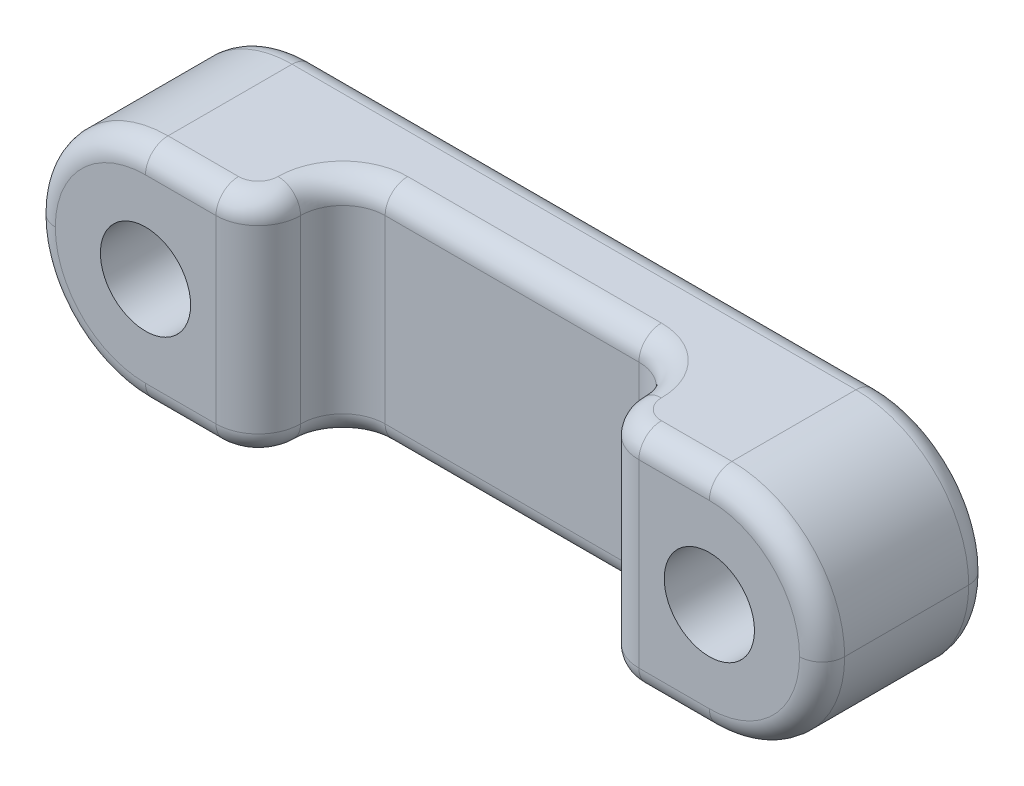
ISO-10303-21;
HEADER;
FILE_DESCRIPTION(('STEP AP214'),'2;1');
FILE_NAME('part.step','',(''),(''),'','','');
FILE_SCHEMA(('AUTOMOTIVE_DESIGN { 1 0 10303 214 1 1 1 1 }'));
ENDSEC;
DATA;
#1=APPLICATION_CONTEXT('core data for automotive mechanical design processes');
#2=APPLICATION_PROTOCOL_DEFINITION('international standard','automotive_design',2000,#1);
#3=PRODUCT_CONTEXT('',#1,'mechanical');
#4=PRODUCT('Part','Part','',(#3));
#5=PRODUCT_RELATED_PRODUCT_CATEGORY('part','',(#4));
#6=PRODUCT_DEFINITION_FORMATION('','',#4);
#7=PRODUCT_DEFINITION_CONTEXT('part definition',#1,'design');
#8=PRODUCT_DEFINITION('design','',#6,#7);
#9=PRODUCT_DEFINITION_SHAPE('','',#8);
#10=(LENGTH_UNIT() NAMED_UNIT(*) SI_UNIT(.MILLI.,.METRE.));
#11=(NAMED_UNIT(*) PLANE_ANGLE_UNIT() SI_UNIT($,.RADIAN.));
#12=(NAMED_UNIT(*) SI_UNIT($,.STERADIAN.) SOLID_ANGLE_UNIT());
#13=UNCERTAINTY_MEASURE_WITH_UNIT(LENGTH_MEASURE(1.E-05),#10,'distance_accuracy_value','');
#14=(GEOMETRIC_REPRESENTATION_CONTEXT(3) GLOBAL_UNCERTAINTY_ASSIGNED_CONTEXT((#13)) GLOBAL_UNIT_ASSIGNED_CONTEXT((#10,
#11,#12)) REPRESENTATION_CONTEXT('',''));
#15=CARTESIAN_POINT('',(0.,0.,0.));
#16=DIRECTION('',(0.,0.,1.));
#17=DIRECTION('',(1.,0.,0.));
#18=AXIS2_PLACEMENT_3D('',#15,#16,#17);
#19=CARTESIAN_POINT('',(0.,0.,3.));
#20=DIRECTION('',(0.,0.,-1.));
#21=DIRECTION('',(-1.,0.,0.));
#22=AXIS2_PLACEMENT_3D('',#19,#20,#21);
#23=PLANE('',#22);
#24=DIRECTION('',(0.,-1.,0.));
#25=VECTOR('',#24,1.);
#26=CARTESIAN_POINT('',(18.5,8.,3.));
#27=LINE('',#26,#25);
#28=CARTESIAN_POINT('',(18.5,0.8,3.));
#29=VERTEX_POINT('',#28);
#30=CARTESIAN_POINT('',(18.5,7.2,3.));
#31=VERTEX_POINT('',#30);
#32=EDGE_CURVE('E226',#29,#31,#27,.F.);
#33=ORIENTED_EDGE('',*,*,#32,.T.);
#34=DIRECTION('',(-1.,0.,0.));
#35=VECTOR('',#34,1.);
#36=CARTESIAN_POINT('',(0.,7.2,3.));
#37=LINE('',#36,#35);
#38=CARTESIAN_POINT('',(9.5,7.2,3.));
#39=VERTEX_POINT('',#38);
#40=EDGE_CURVE('E286',#31,#39,#37,.T.);
#41=ORIENTED_EDGE('',*,*,#40,.T.);
#42=DIRECTION('',(0.,1.,0.));
#43=VECTOR('',#42,1.);
#44=CARTESIAN_POINT('',(9.5,0.,3.));
#45=LINE('',#44,#43);
#46=CARTESIAN_POINT('',(9.5,0.8,3.));
#47=VERTEX_POINT('',#46);
#48=EDGE_CURVE('E229',#39,#47,#45,.F.);
#49=ORIENTED_EDGE('',*,*,#48,.T.);
#50=DIRECTION('',(1.,0.,0.));
#51=VECTOR('',#50,1.);
#52=CARTESIAN_POINT('',(0.,0.8,3.));
#53=LINE('',#52,#51);
#54=EDGE_CURVE('E284',#47,#29,#53,.T.);
#55=ORIENTED_EDGE('',*,*,#54,.T.);
#56=EDGE_LOOP('',(#33,#41,#49,#55));
#57=FACE_BOUND('',#56,.T.);
#58=ADVANCED_FACE('F41',(#57),#23,.F.);
#59=CARTESIAN_POINT('',(0.,0.,0.));
#60=DIRECTION('',(0.,0.,-1.));
#61=DIRECTION('',(-1.,0.,0.));
#62=AXIS2_PLACEMENT_3D('',#59,#60,#61);
#63=PLANE('',#62);
#64=DIRECTION('',(1.,0.,0.));
#65=VECTOR('',#64,1.);
#66=CARTESIAN_POINT('',(4.,0.8,0.));
#67=LINE('',#66,#65);
#68=CARTESIAN_POINT('',(24.,0.8,0.));
#69=VERTEX_POINT('',#68);
#70=CARTESIAN_POINT('',(4.,0.8,0.));
#71=VERTEX_POINT('',#70);
#72=EDGE_CURVE('E205',#69,#71,#67,.F.);
#73=ORIENTED_EDGE('',*,*,#72,.T.);
#74=CARTESIAN_POINT('',(4.,4.,0.));
#75=DIRECTION('',(0.,0.,-1.));
#76=DIRECTION('',(-1.,0.,0.));
#77=AXIS2_PLACEMENT_3D('',#74,#75,#76);
#78=CIRCLE('',#77,3.2);
#79=CARTESIAN_POINT('',(0.8,4.,0.));
#80=VERTEX_POINT('',#79);
#81=EDGE_CURVE('E240',#71,#80,#78,.T.);
#82=ORIENTED_EDGE('',*,*,#81,.T.);
#83=CARTESIAN_POINT('',(4.,4.,0.));
#84=DIRECTION('',(0.,0.,-1.));
#85=DIRECTION('',(-1.,0.,0.));
#86=AXIS2_PLACEMENT_3D('',#83,#84,#85);
#87=CIRCLE('',#86,3.2);
#88=CARTESIAN_POINT('',(4.,7.2,0.));
#89=VERTEX_POINT('',#88);
#90=EDGE_CURVE('E238',#80,#89,#87,.T.);
#91=ORIENTED_EDGE('',*,*,#90,.T.);
#92=DIRECTION('',(-1.,0.,0.));
#93=VECTOR('',#92,1.);
#94=CARTESIAN_POINT('',(24.,7.2,0.));
#95=LINE('',#94,#93);
#96=CARTESIAN_POINT('',(24.,7.2,0.));
#97=VERTEX_POINT('',#96);
#98=EDGE_CURVE('E236',#89,#97,#95,.F.);
#99=ORIENTED_EDGE('',*,*,#98,.T.);
#100=CARTESIAN_POINT('',(24.,4.,0.));
#101=DIRECTION('',(0.,0.,-1.));
#102=DIRECTION('',(-1.,0.,0.));
#103=AXIS2_PLACEMENT_3D('',#100,#101,#102);
#104=CIRCLE('',#103,3.2);
#105=CARTESIAN_POINT('',(27.2,4.,0.));
#106=VERTEX_POINT('',#105);
#107=EDGE_CURVE('E208',#97,#106,#104,.T.);
#108=ORIENTED_EDGE('',*,*,#107,.T.);
#109=CARTESIAN_POINT('',(24.,4.,0.));
#110=DIRECTION('',(0.,0.,-1.));
#111=DIRECTION('',(-1.,0.,0.));
#112=AXIS2_PLACEMENT_3D('',#109,#110,#111);
#113=CIRCLE('',#112,3.2);
#114=EDGE_CURVE('E199',#106,#69,#113,.T.);
#115=ORIENTED_EDGE('',*,*,#114,.T.);
#116=EDGE_LOOP('',(#73,#82,#91,#99,#108,#115));
#117=FACE_BOUND('',#116,.T.);
#118=CARTESIAN_POINT('',(24.,4.,0.));
#119=DIRECTION('',(0.,0.,1.));
#120=DIRECTION('',(1.,0.,0.));
#121=AXIS2_PLACEMENT_3D('',#118,#119,#120);
#122=CIRCLE('',#121,1.6);
#123=CARTESIAN_POINT('',(25.6,4.,0.));
#124=VERTEX_POINT('',#123);
#125=EDGE_CURVE('E441',#124,#124,#122,.T.);
#126=ORIENTED_EDGE('',*,*,#125,.T.);
#127=EDGE_LOOP('',(#126));
#128=FACE_BOUND('',#127,.T.);
#129=CARTESIAN_POINT('',(4.,4.,0.));
#130=DIRECTION('',(0.,0.,1.));
#131=DIRECTION('',(1.,0.,0.));
#132=AXIS2_PLACEMENT_3D('',#129,#130,#131);
#133=CIRCLE('',#132,1.6);
#134=CARTESIAN_POINT('',(5.6,4.,0.));
#135=VERTEX_POINT('',#134);
#136=EDGE_CURVE('E444',#135,#135,#133,.T.);
#137=ORIENTED_EDGE('',*,*,#136,.T.);
#138=EDGE_LOOP('',(#137));
#139=FACE_BOUND('',#138,.T.);
#140=ADVANCED_FACE('F201',(#117,#128,#139),#63,.T.);
#141=CARTESIAN_POINT('',(0.,0.,3.));
#142=DIRECTION('',(0.,1.,0.));
#143=DIRECTION('',(0.,0.,1.));
#144=AXIS2_PLACEMENT_3D('',#141,#142,#143);
#145=PLANE('',#144);
#146=DIRECTION('',(0.,0.,-1.));
#147=VECTOR('',#146,1.);
#148=CARTESIAN_POINT('',(24.,0.,3.));
#149=LINE('',#148,#147);
#150=CARTESIAN_POINT('',(24.,0.,0.8));
#151=VERTEX_POINT('',#150);
#152=CARTESIAN_POINT('',(24.,0.,5.2));
#153=VERTEX_POINT('',#152);
#154=EDGE_CURVE('E412',#151,#153,#149,.F.);
#155=ORIENTED_EDGE('',*,*,#154,.T.);
#156=DIRECTION('',(1.,0.,0.));
#157=VECTOR('',#156,1.);
#158=CARTESIAN_POINT('',(21.5,0.,5.2));
#159=LINE('',#158,#157);
#160=CARTESIAN_POINT('',(21.5,0.,5.2));
#161=VERTEX_POINT('',#160);
#162=EDGE_CURVE('E318',#153,#161,#159,.F.);
#163=ORIENTED_EDGE('',*,*,#162,.T.);
#164=CARTESIAN_POINT('',(21.5,0.,4.5));
#165=DIRECTION('',(0.,1.,0.));
#166=DIRECTION('',(0.,0.,1.));
#167=AXIS2_PLACEMENT_3D('',#164,#165,#166);
#168=CIRCLE('',#167,0.7);
#169=CARTESIAN_POINT('',(20.8,0.,4.5));
#170=VERTEX_POINT('',#169);
#171=EDGE_CURVE('E316',#161,#170,#168,.F.);
#172=ORIENTED_EDGE('',*,*,#171,.T.);
#173=CARTESIAN_POINT('',(18.5,0.,4.5));
#174=DIRECTION('',(0.,1.,0.));
#175=DIRECTION('',(0.,0.,1.));
#176=AXIS2_PLACEMENT_3D('',#173,#174,#175);
#177=CIRCLE('',#176,2.3);
#178=CARTESIAN_POINT('',(18.5,0.,2.2));
#179=VERTEX_POINT('',#178);
#180=EDGE_CURVE('E314',#170,#179,#177,.T.);
#181=ORIENTED_EDGE('',*,*,#180,.T.);
#182=DIRECTION('',(1.,0.,0.));
#183=VECTOR('',#182,1.);
#184=CARTESIAN_POINT('',(0.,0.,2.2));
#185=LINE('',#184,#183);
#186=CARTESIAN_POINT('',(9.5,0.,2.2));
#187=VERTEX_POINT('',#186);
#188=EDGE_CURVE('E312',#179,#187,#185,.F.);
#189=ORIENTED_EDGE('',*,*,#188,.T.);
#190=CARTESIAN_POINT('',(9.5,0.,4.5));
#191=DIRECTION('',(0.,1.,0.));
#192=DIRECTION('',(0.,0.,1.));
#193=AXIS2_PLACEMENT_3D('',#190,#191,#192);
#194=CIRCLE('',#193,2.3);
#195=CARTESIAN_POINT('',(7.2,0.,4.5));
#196=VERTEX_POINT('',#195);
#197=EDGE_CURVE('E310',#187,#196,#194,.T.);
#198=ORIENTED_EDGE('',*,*,#197,.T.);
#199=CARTESIAN_POINT('',(6.5,0.,4.5));
#200=DIRECTION('',(0.,1.,0.));
#201=DIRECTION('',(0.,0.,1.));
#202=AXIS2_PLACEMENT_3D('',#199,#200,#201);
#203=CIRCLE('',#202,0.7);
#204=CARTESIAN_POINT('',(6.5,0.,5.2));
#205=VERTEX_POINT('',#204);
#206=EDGE_CURVE('E308',#196,#205,#203,.F.);
#207=ORIENTED_EDGE('',*,*,#206,.T.);
#208=DIRECTION('',(1.,0.,0.));
#209=VECTOR('',#208,1.);
#210=CARTESIAN_POINT('',(4.,0.,5.2));
#211=LINE('',#210,#209);
#212=CARTESIAN_POINT('',(4.,0.,5.2));
#213=VERTEX_POINT('',#212);
#214=EDGE_CURVE('E306',#205,#213,#211,.F.);
#215=ORIENTED_EDGE('',*,*,#214,.T.);
#216=DIRECTION('',(0.,0.,-1.));
#217=VECTOR('',#216,1.);
#218=CARTESIAN_POINT('',(4.,0.,3.));
#219=LINE('',#218,#217);
#220=CARTESIAN_POINT('',(4.,0.,0.8));
#221=VERTEX_POINT('',#220);
#222=EDGE_CURVE('E432',#213,#221,#219,.T.);
#223=ORIENTED_EDGE('',*,*,#222,.T.);
#224=DIRECTION('',(1.,0.,0.));
#225=VECTOR('',#224,1.);
#226=CARTESIAN_POINT('',(24.,0.,0.8));
#227=LINE('',#226,#225);
#228=EDGE_CURVE('E304',#221,#151,#227,.T.);
#229=ORIENTED_EDGE('',*,*,#228,.T.);
#230=EDGE_LOOP('',(#155,#163,#172,#181,#189,#198,#207,#215,#223,#229));
#231=FACE_BOUND('',#230,.T.);
#232=ADVANCED_FACE('F474',(#231),#145,.F.);
#233=CARTESIAN_POINT('',(0.,8.,3.));
#234=DIRECTION('',(0.,-1.,0.));
#235=DIRECTION('',(0.,0.,-1.));
#236=AXIS2_PLACEMENT_3D('',#233,#234,#235);
#237=PLANE('',#236);
#238=DIRECTION('',(0.,0.,-1.));
#239=VECTOR('',#238,1.);
#240=CARTESIAN_POINT('',(24.,8.,3.));
#241=LINE('',#240,#239);
#242=CARTESIAN_POINT('',(24.,8.,5.2));
#243=VERTEX_POINT('',#242);
#244=CARTESIAN_POINT('',(24.,8.,0.8));
#245=VERTEX_POINT('',#244);
#246=EDGE_CURVE('E435',#243,#245,#241,.T.);
#247=ORIENTED_EDGE('',*,*,#246,.T.);
#248=DIRECTION('',(-1.,0.,0.));
#249=VECTOR('',#248,1.);
#250=CARTESIAN_POINT('',(4.,8.,0.8));
#251=LINE('',#250,#249);
#252=CARTESIAN_POINT('',(4.,8.,0.8));
#253=VERTEX_POINT('',#252);
#254=EDGE_CURVE('E266',#245,#253,#251,.T.);
#255=ORIENTED_EDGE('',*,*,#254,.T.);
#256=DIRECTION('',(0.,0.,-1.));
#257=VECTOR('',#256,1.);
#258=CARTESIAN_POINT('',(4.,8.,3.));
#259=LINE('',#258,#257);
#260=CARTESIAN_POINT('',(4.,8.,5.2));
#261=VERTEX_POINT('',#260);
#262=EDGE_CURVE('E438',#253,#261,#259,.F.);
#263=ORIENTED_EDGE('',*,*,#262,.T.);
#264=DIRECTION('',(-1.,0.,0.));
#265=VECTOR('',#264,1.);
#266=CARTESIAN_POINT('',(6.5,8.,5.2));
#267=LINE('',#266,#265);
#268=CARTESIAN_POINT('',(6.5,8.,5.2));
#269=VERTEX_POINT('',#268);
#270=EDGE_CURVE('E251',#261,#269,#267,.F.);
#271=ORIENTED_EDGE('',*,*,#270,.T.);
#272=CARTESIAN_POINT('',(6.5,8.,4.5));
#273=DIRECTION('',(0.,-1.,0.));
#274=DIRECTION('',(0.,0.,-1.));
#275=AXIS2_PLACEMENT_3D('',#272,#273,#274);
#276=CIRCLE('',#275,0.7);
#277=CARTESIAN_POINT('',(7.2,8.,4.5));
#278=VERTEX_POINT('',#277);
#279=EDGE_CURVE('E253',#269,#278,#276,.F.);
#280=ORIENTED_EDGE('',*,*,#279,.T.);
#281=CARTESIAN_POINT('',(9.5,8.,4.5));
#282=DIRECTION('',(0.,-1.,0.));
#283=DIRECTION('',(0.,0.,-1.));
#284=AXIS2_PLACEMENT_3D('',#281,#282,#283);
#285=CIRCLE('',#284,2.3);
#286=CARTESIAN_POINT('',(9.5,8.,2.2));
#287=VERTEX_POINT('',#286);
#288=EDGE_CURVE('E256',#278,#287,#285,.T.);
#289=ORIENTED_EDGE('',*,*,#288,.T.);
#290=DIRECTION('',(-1.,0.,0.));
#291=VECTOR('',#290,1.);
#292=CARTESIAN_POINT('',(0.,8.,2.2));
#293=LINE('',#292,#291);
#294=CARTESIAN_POINT('',(18.5,8.,2.2));
#295=VERTEX_POINT('',#294);
#296=EDGE_CURVE('E258',#287,#295,#293,.F.);
#297=ORIENTED_EDGE('',*,*,#296,.T.);
#298=CARTESIAN_POINT('',(18.5,8.,4.5));
#299=DIRECTION('',(0.,-1.,0.));
#300=DIRECTION('',(0.,0.,-1.));
#301=AXIS2_PLACEMENT_3D('',#298,#299,#300);
#302=CIRCLE('',#301,2.3);
#303=CARTESIAN_POINT('',(20.8,8.,4.5));
#304=VERTEX_POINT('',#303);
#305=EDGE_CURVE('E260',#295,#304,#302,.T.);
#306=ORIENTED_EDGE('',*,*,#305,.T.);
#307=CARTESIAN_POINT('',(21.5,8.,4.5));
#308=DIRECTION('',(0.,-1.,0.));
#309=DIRECTION('',(0.,0.,-1.));
#310=AXIS2_PLACEMENT_3D('',#307,#308,#309);
#311=CIRCLE('',#310,0.7);
#312=CARTESIAN_POINT('',(21.5,8.,5.2));
#313=VERTEX_POINT('',#312);
#314=EDGE_CURVE('E262',#304,#313,#311,.F.);
#315=ORIENTED_EDGE('',*,*,#314,.T.);
#316=DIRECTION('',(-1.,0.,0.));
#317=VECTOR('',#316,1.);
#318=CARTESIAN_POINT('',(24.,8.,5.2));
#319=LINE('',#318,#317);
#320=EDGE_CURVE('E264',#313,#243,#319,.F.);
#321=ORIENTED_EDGE('',*,*,#320,.T.);
#322=EDGE_LOOP('',(#247,#255,#263,#271,#280,#289,#297,#306,#315,#321));
#323=FACE_BOUND('',#322,.T.);
#324=ADVANCED_FACE('F479',(#323),#237,.F.);
#325=CARTESIAN_POINT('',(24.,4.,3.));
#326=DIRECTION('',(0.,0.,-1.));
#327=DIRECTION('',(-1.,0.,0.));
#328=AXIS2_PLACEMENT_3D('',#325,#326,#327);
#329=CYLINDRICAL_SURFACE('',#328,1.6);
#330=ORIENTED_EDGE('',*,*,#125,.F.);
#331=EDGE_LOOP('',(#330));
#332=FACE_BOUND('',#331,.T.);
#333=CARTESIAN_POINT('',(24.,4.,6.));
#334=DIRECTION('',(0.,0.,1.));
#335=DIRECTION('',(1.,0.,0.));
#336=AXIS2_PLACEMENT_3D('',#333,#334,#335);
#337=CIRCLE('',#336,1.6);
#338=CARTESIAN_POINT('',(25.6,4.,6.));
#339=VERTEX_POINT('',#338);
#340=EDGE_CURVE('E427',#339,#339,#337,.T.);
#341=ORIENTED_EDGE('',*,*,#340,.T.);
#342=EDGE_LOOP('',(#341));
#343=FACE_BOUND('',#342,.T.);
#344=ADVANCED_FACE('F453',(#332,#343),#329,.F.);
#345=CARTESIAN_POINT('',(4.,4.,3.));
#346=DIRECTION('',(0.,0.,-1.));
#347=DIRECTION('',(-1.,0.,0.));
#348=AXIS2_PLACEMENT_3D('',#345,#346,#347);
#349=CYLINDRICAL_SURFACE('',#348,1.6);
#350=ORIENTED_EDGE('',*,*,#136,.F.);
#351=EDGE_LOOP('',(#350));
#352=FACE_BOUND('',#351,.T.);
#353=CARTESIAN_POINT('',(4.,4.,6.));
#354=DIRECTION('',(0.,0.,1.));
#355=DIRECTION('',(1.,0.,0.));
#356=AXIS2_PLACEMENT_3D('',#353,#354,#355);
#357=CIRCLE('',#356,1.6);
#358=CARTESIAN_POINT('',(5.6,4.,6.));
#359=VERTEX_POINT('',#358);
#360=EDGE_CURVE('E447',#359,#359,#357,.T.);
#361=ORIENTED_EDGE('',*,*,#360,.T.);
#362=EDGE_LOOP('',(#361));
#363=FACE_BOUND('',#362,.T.);
#364=ADVANCED_FACE('F465',(#352,#363),#349,.F.);
#365=CARTESIAN_POINT('',(0.,0.,6.));
#366=DIRECTION('',(0.,0.,1.));
#367=DIRECTION('',(1.,0.,0.));
#368=AXIS2_PLACEMENT_3D('',#365,#366,#367);
#369=PLANE('',#368);
#370=CARTESIAN_POINT('',(4.,4.,6.));
#371=DIRECTION('',(0.,0.,1.));
#372=DIRECTION('',(1.,0.,0.));
#373=AXIS2_PLACEMENT_3D('',#370,#371,#372);
#374=CIRCLE('',#373,3.2);
#375=CARTESIAN_POINT('',(0.8,4.,6.));
#376=VERTEX_POINT('',#375);
#377=CARTESIAN_POINT('',(4.,0.8,6.));
#378=VERTEX_POINT('',#377);
#379=EDGE_CURVE('E50',#376,#378,#374,.T.);
#380=ORIENTED_EDGE('',*,*,#379,.T.);
#381=DIRECTION('',(1.,0.,0.));
#382=VECTOR('',#381,1.);
#383=CARTESIAN_POINT('',(6.5,0.8,6.));
#384=LINE('',#383,#382);
#385=CARTESIAN_POINT('',(6.5,0.8,6.));
#386=VERTEX_POINT('',#385);
#387=EDGE_CURVE('E11',#378,#386,#384,.T.);
#388=ORIENTED_EDGE('',*,*,#387,.T.);
#389=DIRECTION('',(0.,1.,0.));
#390=VECTOR('',#389,1.);
#391=CARTESIAN_POINT('',(6.5,8.,6.));
#392=LINE('',#391,#390);
#393=CARTESIAN_POINT('',(6.5,7.2,6.));
#394=VERTEX_POINT('',#393);
#395=EDGE_CURVE('E407',#386,#394,#392,.T.);
#396=ORIENTED_EDGE('',*,*,#395,.T.);
#397=DIRECTION('',(-1.,0.,0.));
#398=VECTOR('',#397,1.);
#399=CARTESIAN_POINT('',(4.,7.2,6.));
#400=LINE('',#399,#398);
#401=CARTESIAN_POINT('',(4.,7.2,6.));
#402=VERTEX_POINT('',#401);
#403=EDGE_CURVE('E320',#394,#402,#400,.T.);
#404=ORIENTED_EDGE('',*,*,#403,.T.);
#405=CARTESIAN_POINT('',(4.,4.,6.));
#406=DIRECTION('',(0.,0.,1.));
#407=DIRECTION('',(1.,0.,0.));
#408=AXIS2_PLACEMENT_3D('',#405,#406,#407);
#409=CIRCLE('',#408,3.2);
#410=EDGE_CURVE('E61',#402,#376,#409,.T.);
#411=ORIENTED_EDGE('',*,*,#410,.T.);
#412=EDGE_LOOP('',(#380,#388,#396,#404,#411));
#413=FACE_BOUND('',#412,.T.);
#414=ORIENTED_EDGE('',*,*,#360,.F.);
#415=EDGE_LOOP('',(#414));
#416=FACE_BOUND('',#415,.T.);
#417=ADVANCED_FACE('F456',(#413,#416),#369,.T.);
#418=CARTESIAN_POINT('',(0.,0.,6.));
#419=DIRECTION('',(0.,0.,1.));
#420=DIRECTION('',(1.,0.,0.));
#421=AXIS2_PLACEMENT_3D('',#418,#419,#420);
#422=PLANE('',#421);
#423=CARTESIAN_POINT('',(24.,4.,6.));
#424=DIRECTION('',(0.,0.,1.));
#425=DIRECTION('',(1.,0.,0.));
#426=AXIS2_PLACEMENT_3D('',#423,#424,#425);
#427=CIRCLE('',#426,3.2);
#428=CARTESIAN_POINT('',(27.2,4.,6.));
#429=VERTEX_POINT('',#428);
#430=CARTESIAN_POINT('',(24.,7.2,6.));
#431=VERTEX_POINT('',#430);
#432=EDGE_CURVE('E300',#429,#431,#427,.T.);
#433=ORIENTED_EDGE('',*,*,#432,.T.);
#434=DIRECTION('',(-1.,0.,0.));
#435=VECTOR('',#434,1.);
#436=CARTESIAN_POINT('',(21.5,7.2,6.));
#437=LINE('',#436,#435);
#438=CARTESIAN_POINT('',(21.5,7.2,6.));
#439=VERTEX_POINT('',#438);
#440=EDGE_CURVE('E302',#431,#439,#437,.T.);
#441=ORIENTED_EDGE('',*,*,#440,.T.);
#442=DIRECTION('',(0.,-1.,0.));
#443=VECTOR('',#442,1.);
#444=CARTESIAN_POINT('',(21.5,0.,6.));
#445=LINE('',#444,#443);
#446=CARTESIAN_POINT('',(21.5,0.8,6.));
#447=VERTEX_POINT('',#446);
#448=EDGE_CURVE('E399',#439,#447,#445,.T.);
#449=ORIENTED_EDGE('',*,*,#448,.T.);
#450=DIRECTION('',(1.,0.,0.));
#451=VECTOR('',#450,1.);
#452=CARTESIAN_POINT('',(24.,0.8,6.));
#453=LINE('',#452,#451);
#454=CARTESIAN_POINT('',(24.,0.8,6.));
#455=VERTEX_POINT('',#454);
#456=EDGE_CURVE('E296',#447,#455,#453,.T.);
#457=ORIENTED_EDGE('',*,*,#456,.T.);
#458=CARTESIAN_POINT('',(24.,4.,6.));
#459=DIRECTION('',(0.,0.,1.));
#460=DIRECTION('',(1.,0.,0.));
#461=AXIS2_PLACEMENT_3D('',#458,#459,#460);
#462=CIRCLE('',#461,3.2);
#463=EDGE_CURVE('E298',#455,#429,#462,.T.);
#464=ORIENTED_EDGE('',*,*,#463,.T.);
#465=EDGE_LOOP('',(#433,#441,#449,#457,#464));
#466=FACE_BOUND('',#465,.T.);
#467=ORIENTED_EDGE('',*,*,#340,.F.);
#468=EDGE_LOOP('',(#467));
#469=FACE_BOUND('',#468,.T.);
#470=ADVANCED_FACE('F403',(#466,#469),#422,.T.);
#471=CARTESIAN_POINT('',(24.,4.,3.));
#472=DIRECTION('',(0.,0.,-1.));
#473=DIRECTION('',(-1.,0.,0.));
#474=AXIS2_PLACEMENT_3D('',#471,#472,#473);
#475=CYLINDRICAL_SURFACE('',#474,4.);
#476=ORIENTED_EDGE('',*,*,#154,.F.);
#477=CARTESIAN_POINT('',(24.,4.,0.8));
#478=DIRECTION('',(0.,0.,-1.));
#479=DIRECTION('',(-1.,0.,0.));
#480=AXIS2_PLACEMENT_3D('',#477,#478,#479);
#481=CIRCLE('',#480,4.);
#482=CARTESIAN_POINT('',(28.,4.,0.8));
#483=VERTEX_POINT('',#482);
#484=EDGE_CURVE('E217',#151,#483,#481,.F.);
#485=ORIENTED_EDGE('',*,*,#484,.T.);
#486=DIRECTION('',(0.,0.,-1.));
#487=VECTOR('',#486,1.);
#488=CARTESIAN_POINT('',(28.,4.,3.));
#489=LINE('',#488,#487);
#490=CARTESIAN_POINT('',(28.,4.,5.2));
#491=VERTEX_POINT('',#490);
#492=EDGE_CURVE('E422',#491,#483,#489,.T.);
#493=ORIENTED_EDGE('',*,*,#492,.F.);
#494=CARTESIAN_POINT('',(24.,4.,5.2));
#495=DIRECTION('',(0.,0.,1.));
#496=DIRECTION('',(1.,0.,0.));
#497=AXIS2_PLACEMENT_3D('',#494,#495,#496);
#498=CIRCLE('',#497,4.);
#499=EDGE_CURVE('E272',#491,#153,#498,.F.);
#500=ORIENTED_EDGE('',*,*,#499,.T.);
#501=EDGE_LOOP('',(#476,#485,#493,#500));
#502=FACE_BOUND('',#501,.T.);
#503=ADVANCED_FACE('F455',(#502),#475,.T.);
#504=CARTESIAN_POINT('',(24.,4.,3.));
#505=DIRECTION('',(0.,0.,-1.));
#506=DIRECTION('',(-1.,0.,0.));
#507=AXIS2_PLACEMENT_3D('',#504,#505,#506);
#508=CYLINDRICAL_SURFACE('',#507,4.);
#509=ORIENTED_EDGE('',*,*,#492,.T.);
#510=CARTESIAN_POINT('',(24.,4.,0.8));
#511=DIRECTION('',(0.,0.,-1.));
#512=DIRECTION('',(-1.,0.,0.));
#513=AXIS2_PLACEMENT_3D('',#510,#511,#512);
#514=CIRCLE('',#513,4.);
#515=EDGE_CURVE('E270',#483,#245,#514,.F.);
#516=ORIENTED_EDGE('',*,*,#515,.T.);
#517=ORIENTED_EDGE('',*,*,#246,.F.);
#518=CARTESIAN_POINT('',(24.,4.,5.2));
#519=DIRECTION('',(0.,0.,1.));
#520=DIRECTION('',(1.,0.,0.));
#521=AXIS2_PLACEMENT_3D('',#518,#519,#520);
#522=CIRCLE('',#521,4.);
#523=EDGE_CURVE('E268',#243,#491,#522,.F.);
#524=ORIENTED_EDGE('',*,*,#523,.T.);
#525=EDGE_LOOP('',(#509,#516,#517,#524));
#526=FACE_BOUND('',#525,.T.);
#527=ADVANCED_FACE('F462',(#526),#508,.T.);
#528=CARTESIAN_POINT('',(4.,4.,3.));
#529=DIRECTION('',(0.,0.,-1.));
#530=DIRECTION('',(-1.,0.,0.));
#531=AXIS2_PLACEMENT_3D('',#528,#529,#530);
#532=CYLINDRICAL_SURFACE('',#531,4.);
#533=DIRECTION('',(0.,0.,-1.));
#534=VECTOR('',#533,1.);
#535=CARTESIAN_POINT('',(0.,4.,3.));
#536=LINE('',#535,#534);
#537=CARTESIAN_POINT('',(0.,4.,0.8));
#538=VERTEX_POINT('',#537);
#539=CARTESIAN_POINT('',(0.,4.,5.2));
#540=VERTEX_POINT('',#539);
#541=EDGE_CURVE('E417',#538,#540,#536,.F.);
#542=ORIENTED_EDGE('',*,*,#541,.F.);
#543=CARTESIAN_POINT('',(4.,4.,0.8));
#544=DIRECTION('',(0.,0.,-1.));
#545=DIRECTION('',(-1.,0.,0.));
#546=AXIS2_PLACEMENT_3D('',#543,#544,#545);
#547=CIRCLE('',#546,4.);
#548=EDGE_CURVE('E244',#538,#221,#547,.F.);
#549=ORIENTED_EDGE('',*,*,#548,.T.);
#550=ORIENTED_EDGE('',*,*,#222,.F.);
#551=CARTESIAN_POINT('',(4.,4.,5.2));
#552=DIRECTION('',(0.,0.,1.));
#553=DIRECTION('',(1.,0.,0.));
#554=AXIS2_PLACEMENT_3D('',#551,#552,#553);
#555=CIRCLE('',#554,4.);
#556=EDGE_CURVE('E242',#213,#540,#555,.F.);
#557=ORIENTED_EDGE('',*,*,#556,.T.);
#558=EDGE_LOOP('',(#542,#549,#550,#557));
#559=FACE_BOUND('',#558,.T.);
#560=ADVANCED_FACE('F487',(#559),#532,.T.);
#561=CARTESIAN_POINT('',(4.,4.,3.));
#562=DIRECTION('',(0.,0.,-1.));
#563=DIRECTION('',(-1.,0.,0.));
#564=AXIS2_PLACEMENT_3D('',#561,#562,#563);
#565=CYLINDRICAL_SURFACE('',#564,4.);
#566=ORIENTED_EDGE('',*,*,#262,.F.);
#567=CARTESIAN_POINT('',(4.,4.,0.8));
#568=DIRECTION('',(0.,0.,-1.));
#569=DIRECTION('',(-1.,0.,0.));
#570=AXIS2_PLACEMENT_3D('',#567,#568,#569);
#571=CIRCLE('',#570,4.);
#572=EDGE_CURVE('E249',#253,#538,#571,.F.);
#573=ORIENTED_EDGE('',*,*,#572,.T.);
#574=ORIENTED_EDGE('',*,*,#541,.T.);
#575=CARTESIAN_POINT('',(4.,4.,5.2));
#576=DIRECTION('',(0.,0.,1.));
#577=DIRECTION('',(1.,0.,0.));
#578=AXIS2_PLACEMENT_3D('',#575,#576,#577);
#579=CIRCLE('',#578,4.);
#580=EDGE_CURVE('E247',#540,#261,#579,.F.);
#581=ORIENTED_EDGE('',*,*,#580,.T.);
#582=EDGE_LOOP('',(#566,#573,#574,#581));
#583=FACE_BOUND('',#582,.T.);
#584=ADVANCED_FACE('F490',(#583),#565,.T.);
#585=CARTESIAN_POINT('',(9.5,8.,4.5));
#586=DIRECTION('',(0.,-1.,0.));
#587=DIRECTION('',(1.,0.,0.));
#588=AXIS2_PLACEMENT_3D('',#585,#586,#587);
#589=CYLINDRICAL_SURFACE('',#588,1.5);
#590=ORIENTED_EDGE('',*,*,#48,.F.);
#591=CARTESIAN_POINT('',(9.5,7.2,4.5));
#592=DIRECTION('',(0.,-1.,0.));
#593=DIRECTION('',(0.,0.,-1.));
#594=AXIS2_PLACEMENT_3D('',#591,#592,#593);
#595=CIRCLE('',#594,1.5);
#596=CARTESIAN_POINT('',(8.,7.2,4.5));
#597=VERTEX_POINT('',#596);
#598=EDGE_CURVE('E282',#39,#597,#595,.F.);
#599=ORIENTED_EDGE('',*,*,#598,.T.);
#600=DIRECTION('',(0.,1.,0.));
#601=VECTOR('',#600,1.);
#602=CARTESIAN_POINT('',(8.,8.,4.5));
#603=LINE('',#602,#601);
#604=CARTESIAN_POINT('',(8.,0.8,4.5));
#605=VERTEX_POINT('',#604);
#606=EDGE_CURVE('E415',#605,#597,#603,.T.);
#607=ORIENTED_EDGE('',*,*,#606,.F.);
#608=CARTESIAN_POINT('',(9.5,0.8,4.5));
#609=DIRECTION('',(0.,1.,0.));
#610=DIRECTION('',(0.,0.,1.));
#611=AXIS2_PLACEMENT_3D('',#608,#609,#610);
#612=CIRCLE('',#611,1.5);
#613=EDGE_CURVE('E280',#605,#47,#612,.F.);
#614=ORIENTED_EDGE('',*,*,#613,.T.);
#615=EDGE_LOOP('',(#590,#599,#607,#614));
#616=FACE_BOUND('',#615,.T.);
#617=ADVANCED_FACE('F493',(#616),#589,.F.);
#618=CARTESIAN_POINT('',(6.5,0.,4.5));
#619=DIRECTION('',(0.,-1.,0.));
#620=DIRECTION('',(1.,0.,0.));
#621=AXIS2_PLACEMENT_3D('',#618,#619,#620);
#622=CYLINDRICAL_SURFACE('',#621,1.5);
#623=ORIENTED_EDGE('',*,*,#606,.T.);
#624=CARTESIAN_POINT('',(6.5,7.2,4.5));
#625=DIRECTION('',(0.,-1.,0.));
#626=DIRECTION('',(0.,0.,-1.));
#627=AXIS2_PLACEMENT_3D('',#624,#625,#626);
#628=CIRCLE('',#627,1.5);
#629=EDGE_CURVE('E277',#597,#394,#628,.T.);
#630=ORIENTED_EDGE('',*,*,#629,.T.);
#631=ORIENTED_EDGE('',*,*,#395,.F.);
#632=CARTESIAN_POINT('',(6.5,0.8,4.5));
#633=DIRECTION('',(0.,1.,0.));
#634=DIRECTION('',(0.,0.,1.));
#635=AXIS2_PLACEMENT_3D('',#632,#633,#634);
#636=CIRCLE('',#635,1.5);
#637=EDGE_CURVE('E275',#386,#605,#636,.T.);
#638=ORIENTED_EDGE('',*,*,#637,.T.);
#639=EDGE_LOOP('',(#623,#630,#631,#638));
#640=FACE_BOUND('',#639,.T.);
#641=ADVANCED_FACE('F497',(#640),#622,.T.);
#642=CARTESIAN_POINT('',(18.5,0.,4.5));
#643=DIRECTION('',(0.,1.,0.));
#644=DIRECTION('',(0.,0.,1.));
#645=AXIS2_PLACEMENT_3D('',#642,#643,#644);
#646=CYLINDRICAL_SURFACE('',#645,1.5);
#647=DIRECTION('',(0.,-1.,0.));
#648=VECTOR('',#647,1.);
#649=CARTESIAN_POINT('',(20.,0.,4.5));
#650=LINE('',#649,#648);
#651=CARTESIAN_POINT('',(20.,7.2,4.5));
#652=VERTEX_POINT('',#651);
#653=CARTESIAN_POINT('',(20.,0.8,4.5));
#654=VERTEX_POINT('',#653);
#655=EDGE_CURVE('E232',#652,#654,#650,.T.);
#656=ORIENTED_EDGE('',*,*,#655,.F.);
#657=CARTESIAN_POINT('',(18.5,7.2,4.5));
#658=DIRECTION('',(0.,-1.,0.));
#659=DIRECTION('',(0.,0.,-1.));
#660=AXIS2_PLACEMENT_3D('',#657,#658,#659);
#661=CIRCLE('',#660,1.5);
#662=EDGE_CURVE('E290',#652,#31,#661,.F.);
#663=ORIENTED_EDGE('',*,*,#662,.T.);
#664=ORIENTED_EDGE('',*,*,#32,.F.);
#665=CARTESIAN_POINT('',(18.5,0.8,4.5));
#666=DIRECTION('',(0.,1.,0.));
#667=DIRECTION('',(0.,0.,1.));
#668=AXIS2_PLACEMENT_3D('',#665,#666,#667);
#669=CIRCLE('',#668,1.5);
#670=EDGE_CURVE('E288',#29,#654,#669,.F.);
#671=ORIENTED_EDGE('',*,*,#670,.T.);
#672=EDGE_LOOP('',(#656,#663,#664,#671));
#673=FACE_BOUND('',#672,.T.);
#674=ADVANCED_FACE('F500',(#673),#646,.F.);
#675=CARTESIAN_POINT('',(21.5,0.,4.5));
#676=DIRECTION('',(0.,1.,0.));
#677=DIRECTION('',(0.,0.,1.));
#678=AXIS2_PLACEMENT_3D('',#675,#676,#677);
#679=CYLINDRICAL_SURFACE('',#678,1.5);
#680=ORIENTED_EDGE('',*,*,#448,.F.);
#681=CARTESIAN_POINT('',(21.5,7.2,4.5));
#682=DIRECTION('',(0.,-1.,0.));
#683=DIRECTION('',(0.,0.,-1.));
#684=AXIS2_PLACEMENT_3D('',#681,#682,#683);
#685=CIRCLE('',#684,1.5);
#686=EDGE_CURVE('E294',#439,#652,#685,.T.);
#687=ORIENTED_EDGE('',*,*,#686,.T.);
#688=ORIENTED_EDGE('',*,*,#655,.T.);
#689=CARTESIAN_POINT('',(21.5,0.8,4.5));
#690=DIRECTION('',(0.,1.,0.));
#691=DIRECTION('',(0.,0.,1.));
#692=AXIS2_PLACEMENT_3D('',#689,#690,#691);
#693=CIRCLE('',#692,1.5);
#694=EDGE_CURVE('E292',#654,#447,#693,.T.);
#695=ORIENTED_EDGE('',*,*,#694,.T.);
#696=EDGE_LOOP('',(#680,#687,#688,#695));
#697=FACE_BOUND('',#696,.T.);
#698=ADVANCED_FACE('F398',(#697),#679,.T.);
#699=CARTESIAN_POINT('',(24.,4.,0.8));
#700=DIRECTION('',(0.,0.,-1.));
#701=DIRECTION('',(-1.,0.,0.));
#702=AXIS2_PLACEMENT_3D('',#699,#700,#701);
#703=TOROIDAL_SURFACE('',#702,3.2,0.8);
#704=CARTESIAN_POINT('',(24.,7.2,0.8));
#705=DIRECTION('',(-1.,0.,0.));
#706=DIRECTION('',(0.,0.,1.));
#707=AXIS2_PLACEMENT_3D('',#704,#705,#706);
#708=CIRCLE('',#707,0.8);
#709=EDGE_CURVE('E220',#245,#97,#708,.T.);
#710=ORIENTED_EDGE('',*,*,#709,.F.);
#711=ORIENTED_EDGE('',*,*,#515,.F.);
#712=CARTESIAN_POINT('',(27.2,4.,0.8));
#713=DIRECTION('',(0.,-1.,0.));
#714=DIRECTION('',(0.,0.,-1.));
#715=AXIS2_PLACEMENT_3D('',#712,#713,#714);
#716=CIRCLE('',#715,0.8);
#717=EDGE_CURVE('E331',#106,#483,#716,.T.);
#718=ORIENTED_EDGE('',*,*,#717,.F.);
#719=ORIENTED_EDGE('',*,*,#107,.F.);
#720=EDGE_LOOP('',(#710,#711,#718,#719));
#721=FACE_BOUND('',#720,.T.);
#722=ADVANCED_FACE('F506',(#721),#703,.T.);
#723=CARTESIAN_POINT('',(24.,4.,0.8));
#724=DIRECTION('',(0.,0.,-1.));
#725=DIRECTION('',(-1.,0.,0.));
#726=AXIS2_PLACEMENT_3D('',#723,#724,#725);
#727=TOROIDAL_SURFACE('',#726,3.2,0.8);
#728=ORIENTED_EDGE('',*,*,#717,.T.);
#729=ORIENTED_EDGE('',*,*,#484,.F.);
#730=CARTESIAN_POINT('',(24.,0.8,0.8));
#731=DIRECTION('',(-1.,0.,0.));
#732=DIRECTION('',(0.,0.,1.));
#733=AXIS2_PLACEMENT_3D('',#730,#731,#732);
#734=CIRCLE('',#733,0.8);
#735=EDGE_CURVE('E215',#69,#151,#734,.T.);
#736=ORIENTED_EDGE('',*,*,#735,.F.);
#737=ORIENTED_EDGE('',*,*,#114,.F.);
#738=EDGE_LOOP('',(#728,#729,#736,#737));
#739=FACE_BOUND('',#738,.T.);
#740=ADVANCED_FACE('F216',(#739),#727,.T.);
#741=CARTESIAN_POINT('',(0.,7.2,0.8));
#742=DIRECTION('',(1.,0.,0.));
#743=DIRECTION('',(0.,0.,-1.));
#744=AXIS2_PLACEMENT_3D('',#741,#742,#743);
#745=CYLINDRICAL_SURFACE('',#744,0.8);
#746=ORIENTED_EDGE('',*,*,#709,.T.);
#747=ORIENTED_EDGE('',*,*,#98,.F.);
#748=CARTESIAN_POINT('',(4.,7.2,0.8));
#749=DIRECTION('',(-1.,0.,0.));
#750=DIRECTION('',(0.,0.,1.));
#751=AXIS2_PLACEMENT_3D('',#748,#749,#750);
#752=CIRCLE('',#751,0.8);
#753=EDGE_CURVE('E221',#253,#89,#752,.T.);
#754=ORIENTED_EDGE('',*,*,#753,.F.);
#755=ORIENTED_EDGE('',*,*,#254,.F.);
#756=EDGE_LOOP('',(#746,#747,#754,#755));
#757=FACE_BOUND('',#756,.T.);
#758=ADVANCED_FACE('F520',(#757),#745,.T.);
#759=CARTESIAN_POINT('',(0.,0.8,0.8));
#760=DIRECTION('',(-1.,0.,0.));
#761=DIRECTION('',(0.,0.,1.));
#762=AXIS2_PLACEMENT_3D('',#759,#760,#761);
#763=CYLINDRICAL_SURFACE('',#762,0.8);
#764=ORIENTED_EDGE('',*,*,#735,.T.);
#765=ORIENTED_EDGE('',*,*,#228,.F.);
#766=CARTESIAN_POINT('',(4.,0.8,0.8));
#767=DIRECTION('',(-1.,0.,0.));
#768=DIRECTION('',(0.,0.,1.));
#769=AXIS2_PLACEMENT_3D('',#766,#767,#768);
#770=CIRCLE('',#769,0.8);
#771=EDGE_CURVE('E224',#71,#221,#770,.T.);
#772=ORIENTED_EDGE('',*,*,#771,.F.);
#773=ORIENTED_EDGE('',*,*,#72,.F.);
#774=EDGE_LOOP('',(#764,#765,#772,#773));
#775=FACE_BOUND('',#774,.T.);
#776=ADVANCED_FACE('F223',(#775),#763,.T.);
#777=CARTESIAN_POINT('',(4.,4.,0.8));
#778=DIRECTION('',(0.,0.,-1.));
#779=DIRECTION('',(-1.,0.,0.));
#780=AXIS2_PLACEMENT_3D('',#777,#778,#779);
#781=TOROIDAL_SURFACE('',#780,3.2,0.8);
#782=ORIENTED_EDGE('',*,*,#753,.T.);
#783=ORIENTED_EDGE('',*,*,#90,.F.);
#784=CARTESIAN_POINT('',(0.8,4.,0.8));
#785=DIRECTION('',(0.,-1.,0.));
#786=DIRECTION('',(0.,0.,-1.));
#787=AXIS2_PLACEMENT_3D('',#784,#785,#786);
#788=CIRCLE('',#787,0.8);
#789=EDGE_CURVE('E324',#538,#80,#788,.T.);
#790=ORIENTED_EDGE('',*,*,#789,.F.);
#791=ORIENTED_EDGE('',*,*,#572,.F.);
#792=EDGE_LOOP('',(#782,#783,#790,#791));
#793=FACE_BOUND('',#792,.T.);
#794=ADVANCED_FACE('F513',(#793),#781,.T.);
#795=CARTESIAN_POINT('',(4.,4.,0.8));
#796=DIRECTION('',(0.,0.,-1.));
#797=DIRECTION('',(-1.,0.,0.));
#798=AXIS2_PLACEMENT_3D('',#795,#796,#797);
#799=TOROIDAL_SURFACE('',#798,3.2,0.8);
#800=ORIENTED_EDGE('',*,*,#771,.T.);
#801=ORIENTED_EDGE('',*,*,#548,.F.);
#802=ORIENTED_EDGE('',*,*,#789,.T.);
#803=ORIENTED_EDGE('',*,*,#81,.F.);
#804=EDGE_LOOP('',(#800,#801,#802,#803));
#805=FACE_BOUND('',#804,.T.);
#806=ADVANCED_FACE('F510',(#805),#799,.T.);
#807=CARTESIAN_POINT('',(21.5,0.8,4.5));
#808=DIRECTION('',(0.,1.,0.));
#809=DIRECTION('',(0.,0.,1.));
#810=AXIS2_PLACEMENT_3D('',#807,#808,#809);
#811=DEGENERATE_TOROIDAL_SURFACE('',#810,0.7,0.8,.T.);
#812=CARTESIAN_POINT('',(21.5,0.8,5.2));
#813=DIRECTION('',(1.,0.,0.));
#814=DIRECTION('',(0.,0.,-1.));
#815=AXIS2_PLACEMENT_3D('',#812,#813,#814);
#816=CIRCLE('',#815,0.8);
#817=EDGE_CURVE('E378',#447,#161,#816,.T.);
#818=ORIENTED_EDGE('',*,*,#817,.F.);
#819=ORIENTED_EDGE('',*,*,#694,.F.);
#820=CARTESIAN_POINT('',(20.8,0.8,4.5));
#821=DIRECTION('',(0.,0.,-1.));
#822=DIRECTION('',(-1.,0.,0.));
#823=AXIS2_PLACEMENT_3D('',#820,#821,#822);
#824=CIRCLE('',#823,0.8);
#825=EDGE_CURVE('E45',#170,#654,#824,.T.);
#826=ORIENTED_EDGE('',*,*,#825,.F.);
#827=ORIENTED_EDGE('',*,*,#171,.F.);
#828=EDGE_LOOP('',(#818,#819,#826,#827));
#829=FACE_BOUND('',#828,.T.);
#830=ADVANCED_FACE('F43',(#829),#811,.T.);
#831=CARTESIAN_POINT('',(18.5,0.8,4.5));
#832=DIRECTION('',(0.,1.,0.));
#833=DIRECTION('',(0.,0.,1.));
#834=AXIS2_PLACEMENT_3D('',#831,#832,#833);
#835=TOROIDAL_SURFACE('',#834,2.3,0.8);
#836=ORIENTED_EDGE('',*,*,#825,.T.);
#837=ORIENTED_EDGE('',*,*,#670,.F.);
#838=CARTESIAN_POINT('',(18.5,0.8,2.2));
#839=DIRECTION('',(-1.,0.,0.));
#840=DIRECTION('',(0.,0.,1.));
#841=AXIS2_PLACEMENT_3D('',#838,#839,#840);
#842=CIRCLE('',#841,0.8);
#843=EDGE_CURVE('E376',#179,#29,#842,.T.);
#844=ORIENTED_EDGE('',*,*,#843,.F.);
#845=ORIENTED_EDGE('',*,*,#180,.F.);
#846=EDGE_LOOP('',(#836,#837,#844,#845));
#847=FACE_BOUND('',#846,.T.);
#848=ADVANCED_FACE('F389',(#847),#835,.T.);
#849=CARTESIAN_POINT('',(0.,0.8,5.2));
#850=DIRECTION('',(-1.,0.,0.));
#851=DIRECTION('',(0.,0.,1.));
#852=AXIS2_PLACEMENT_3D('',#849,#850,#851);
#853=CYLINDRICAL_SURFACE('',#852,0.8);
#854=ORIENTED_EDGE('',*,*,#817,.T.);
#855=ORIENTED_EDGE('',*,*,#162,.F.);
#856=CARTESIAN_POINT('',(24.,0.8,5.2));
#857=DIRECTION('',(1.,0.,0.));
#858=DIRECTION('',(0.,0.,-1.));
#859=AXIS2_PLACEMENT_3D('',#856,#857,#858);
#860=CIRCLE('',#859,0.8);
#861=EDGE_CURVE('E373',#455,#153,#860,.T.);
#862=ORIENTED_EDGE('',*,*,#861,.F.);
#863=ORIENTED_EDGE('',*,*,#456,.F.);
#864=EDGE_LOOP('',(#854,#855,#862,#863));
#865=FACE_BOUND('',#864,.T.);
#866=ADVANCED_FACE('F588',(#865),#853,.T.);
#867=CARTESIAN_POINT('',(0.,0.8,2.2));
#868=DIRECTION('',(1.,0.,0.));
#869=DIRECTION('',(0.,0.,-1.));
#870=AXIS2_PLACEMENT_3D('',#867,#868,#869);
#871=CYLINDRICAL_SURFACE('',#870,0.8);
#872=ORIENTED_EDGE('',*,*,#843,.T.);
#873=ORIENTED_EDGE('',*,*,#54,.F.);
#874=CARTESIAN_POINT('',(9.5,0.8,2.2));
#875=DIRECTION('',(-1.,0.,0.));
#876=DIRECTION('',(0.,0.,1.));
#877=AXIS2_PLACEMENT_3D('',#874,#875,#876);
#878=CIRCLE('',#877,0.8);
#879=EDGE_CURVE('E370',#187,#47,#878,.T.);
#880=ORIENTED_EDGE('',*,*,#879,.F.);
#881=ORIENTED_EDGE('',*,*,#188,.F.);
#882=EDGE_LOOP('',(#872,#873,#880,#881));
#883=FACE_BOUND('',#882,.T.);
#884=ADVANCED_FACE('F584',(#883),#871,.T.);
#885=CARTESIAN_POINT('',(24.,4.,5.2));
#886=DIRECTION('',(0.,0.,1.));
#887=DIRECTION('',(1.,0.,0.));
#888=AXIS2_PLACEMENT_3D('',#885,#886,#887);
#889=TOROIDAL_SURFACE('',#888,3.2,0.8);
#890=ORIENTED_EDGE('',*,*,#861,.T.);
#891=ORIENTED_EDGE('',*,*,#499,.F.);
#892=CARTESIAN_POINT('',(27.2,4.,5.2));
#893=DIRECTION('',(0.,1.,0.));
#894=DIRECTION('',(0.,0.,1.));
#895=AXIS2_PLACEMENT_3D('',#892,#893,#894);
#896=CIRCLE('',#895,0.8);
#897=EDGE_CURVE('E367',#429,#491,#896,.T.);
#898=ORIENTED_EDGE('',*,*,#897,.F.);
#899=ORIENTED_EDGE('',*,*,#463,.F.);
#900=EDGE_LOOP('',(#890,#891,#898,#899));
#901=FACE_BOUND('',#900,.T.);
#902=ADVANCED_FACE('F580',(#901),#889,.T.);
#903=CARTESIAN_POINT('',(9.5,0.8,4.5));
#904=DIRECTION('',(0.,1.,0.));
#905=DIRECTION('',(0.,0.,1.));
#906=AXIS2_PLACEMENT_3D('',#903,#904,#905);
#907=TOROIDAL_SURFACE('',#906,2.3,0.8);
#908=ORIENTED_EDGE('',*,*,#879,.T.);
#909=ORIENTED_EDGE('',*,*,#613,.F.);
#910=CARTESIAN_POINT('',(7.2,0.8,4.5));
#911=DIRECTION('',(0.,0.,1.));
#912=DIRECTION('',(1.,0.,0.));
#913=AXIS2_PLACEMENT_3D('',#910,#911,#912);
#914=CIRCLE('',#913,0.8);
#915=EDGE_CURVE('E364',#196,#605,#914,.T.);
#916=ORIENTED_EDGE('',*,*,#915,.F.);
#917=ORIENTED_EDGE('',*,*,#197,.F.);
#918=EDGE_LOOP('',(#908,#909,#916,#917));
#919=FACE_BOUND('',#918,.T.);
#920=ADVANCED_FACE('F576',(#919),#907,.T.);
#921=CARTESIAN_POINT('',(24.,4.,5.2));
#922=DIRECTION('',(0.,0.,1.));
#923=DIRECTION('',(1.,0.,0.));
#924=AXIS2_PLACEMENT_3D('',#921,#922,#923);
#925=TOROIDAL_SURFACE('',#924,3.2,0.8);
#926=ORIENTED_EDGE('',*,*,#897,.T.);
#927=ORIENTED_EDGE('',*,*,#523,.F.);
#928=CARTESIAN_POINT('',(24.,7.2,5.2));
#929=DIRECTION('',(-1.,0.,0.));
#930=DIRECTION('',(0.,0.,1.));
#931=AXIS2_PLACEMENT_3D('',#928,#929,#930);
#932=CIRCLE('',#931,0.8);
#933=EDGE_CURVE('E361',#431,#243,#932,.T.);
#934=ORIENTED_EDGE('',*,*,#933,.F.);
#935=ORIENTED_EDGE('',*,*,#432,.F.);
#936=EDGE_LOOP('',(#926,#927,#934,#935));
#937=FACE_BOUND('',#936,.T.);
#938=ADVANCED_FACE('F572',(#937),#925,.T.);
#939=CARTESIAN_POINT('',(6.5,0.8,4.5));
#940=DIRECTION('',(0.,1.,0.));
#941=DIRECTION('',(0.,0.,1.));
#942=AXIS2_PLACEMENT_3D('',#939,#940,#941);
#943=DEGENERATE_TOROIDAL_SURFACE('',#942,0.7,0.8,.T.);
#944=ORIENTED_EDGE('',*,*,#915,.T.);
#945=ORIENTED_EDGE('',*,*,#637,.F.);
#946=CARTESIAN_POINT('',(6.5,0.8,5.2));
#947=DIRECTION('',(-1.,0.,0.));
#948=DIRECTION('',(0.,0.,1.));
#949=AXIS2_PLACEMENT_3D('',#946,#947,#948);
#950=CIRCLE('',#949,0.8);
#951=EDGE_CURVE('E358',#205,#386,#950,.T.);
#952=ORIENTED_EDGE('',*,*,#951,.F.);
#953=ORIENTED_EDGE('',*,*,#206,.F.);
#954=EDGE_LOOP('',(#944,#945,#952,#953));
#955=FACE_BOUND('',#954,.T.);
#956=ADVANCED_FACE('F568',(#955),#943,.T.);
#957=CARTESIAN_POINT('',(0.,7.2,5.2));
#958=DIRECTION('',(1.,0.,0.));
#959=DIRECTION('',(0.,0.,-1.));
#960=AXIS2_PLACEMENT_3D('',#957,#958,#959);
#961=CYLINDRICAL_SURFACE('',#960,0.8);
#962=ORIENTED_EDGE('',*,*,#933,.T.);
#963=ORIENTED_EDGE('',*,*,#320,.F.);
#964=CARTESIAN_POINT('',(21.5,7.2,5.2));
#965=DIRECTION('',(-1.,0.,0.));
#966=DIRECTION('',(0.,0.,1.));
#967=AXIS2_PLACEMENT_3D('',#964,#965,#966);
#968=CIRCLE('',#967,0.8);
#969=EDGE_CURVE('E355',#439,#313,#968,.T.);
#970=ORIENTED_EDGE('',*,*,#969,.F.);
#971=ORIENTED_EDGE('',*,*,#440,.F.);
#972=EDGE_LOOP('',(#962,#963,#970,#971));
#973=FACE_BOUND('',#972,.T.);
#974=ADVANCED_FACE('F564',(#973),#961,.T.);
#975=CARTESIAN_POINT('',(0.,0.8,5.2));
#976=DIRECTION('',(-1.,0.,0.));
#977=DIRECTION('',(0.,0.,1.));
#978=AXIS2_PLACEMENT_3D('',#975,#976,#977);
#979=CYLINDRICAL_SURFACE('',#978,0.8);
#980=ORIENTED_EDGE('',*,*,#951,.T.);
#981=ORIENTED_EDGE('',*,*,#387,.F.);
#982=CARTESIAN_POINT('',(4.,0.8,5.2));
#983=DIRECTION('',(-1.,0.,0.));
#984=DIRECTION('',(0.,0.,1.));
#985=AXIS2_PLACEMENT_3D('',#982,#983,#984);
#986=CIRCLE('',#985,0.8);
#987=EDGE_CURVE('E352',#213,#378,#986,.T.);
#988=ORIENTED_EDGE('',*,*,#987,.F.);
#989=ORIENTED_EDGE('',*,*,#214,.F.);
#990=EDGE_LOOP('',(#980,#981,#988,#989));
#991=FACE_BOUND('',#990,.T.);
#992=ADVANCED_FACE('F560',(#991),#979,.T.);
#993=CARTESIAN_POINT('',(21.5,7.2,4.5));
#994=DIRECTION('',(0.,-1.,0.));
#995=DIRECTION('',(0.,0.,-1.));
#996=AXIS2_PLACEMENT_3D('',#993,#994,#995);
#997=DEGENERATE_TOROIDAL_SURFACE('',#996,0.7,0.8,.T.);
#998=ORIENTED_EDGE('',*,*,#969,.T.);
#999=ORIENTED_EDGE('',*,*,#314,.F.);
#1000=CARTESIAN_POINT('',(20.8,7.2,4.5));
#1001=DIRECTION('',(0.,0.,-1.));
#1002=DIRECTION('',(-1.,0.,0.));
#1003=AXIS2_PLACEMENT_3D('',#1000,#1001,#1002);
#1004=CIRCLE('',#1003,0.8);
#1005=EDGE_CURVE('E349',#652,#304,#1004,.T.);
#1006=ORIENTED_EDGE('',*,*,#1005,.F.);
#1007=ORIENTED_EDGE('',*,*,#686,.F.);
#1008=EDGE_LOOP('',(#998,#999,#1006,#1007));
#1009=FACE_BOUND('',#1008,.T.);
#1010=ADVANCED_FACE('F556',(#1009),#997,.T.);
#1011=CARTESIAN_POINT('',(4.,4.,5.2));
#1012=DIRECTION('',(0.,0.,1.));
#1013=DIRECTION('',(1.,0.,0.));
#1014=AXIS2_PLACEMENT_3D('',#1011,#1012,#1013);
#1015=TOROIDAL_SURFACE('',#1014,3.2,0.8);
#1016=ORIENTED_EDGE('',*,*,#987,.T.);
#1017=ORIENTED_EDGE('',*,*,#379,.F.);
#1018=CARTESIAN_POINT('',(0.8,4.,5.2));
#1019=DIRECTION('',(0.,1.,0.));
#1020=DIRECTION('',(0.,0.,1.));
#1021=AXIS2_PLACEMENT_3D('',#1018,#1019,#1020);
#1022=CIRCLE('',#1021,0.8);
#1023=EDGE_CURVE('E346',#540,#376,#1022,.T.);
#1024=ORIENTED_EDGE('',*,*,#1023,.F.);
#1025=ORIENTED_EDGE('',*,*,#556,.F.);
#1026=EDGE_LOOP('',(#1016,#1017,#1024,#1025));
#1027=FACE_BOUND('',#1026,.T.);
#1028=ADVANCED_FACE('F552',(#1027),#1015,.T.);
#1029=CARTESIAN_POINT('',(18.5,7.2,4.5));
#1030=DIRECTION('',(0.,-1.,0.));
#1031=DIRECTION('',(0.,0.,-1.));
#1032=AXIS2_PLACEMENT_3D('',#1029,#1030,#1031);
#1033=TOROIDAL_SURFACE('',#1032,2.3,0.8);
#1034=ORIENTED_EDGE('',*,*,#1005,.T.);
#1035=ORIENTED_EDGE('',*,*,#305,.F.);
#1036=CARTESIAN_POINT('',(18.5,7.2,2.2));
#1037=DIRECTION('',(-1.,0.,0.));
#1038=DIRECTION('',(0.,0.,1.));
#1039=AXIS2_PLACEMENT_3D('',#1036,#1037,#1038);
#1040=CIRCLE('',#1039,0.8);
#1041=EDGE_CURVE('E343',#31,#295,#1040,.T.);
#1042=ORIENTED_EDGE('',*,*,#1041,.F.);
#1043=ORIENTED_EDGE('',*,*,#662,.F.);
#1044=EDGE_LOOP('',(#1034,#1035,#1042,#1043));
#1045=FACE_BOUND('',#1044,.T.);
#1046=ADVANCED_FACE('F548',(#1045),#1033,.T.);
#1047=CARTESIAN_POINT('',(4.,4.,5.2));
#1048=DIRECTION('',(0.,0.,1.));
#1049=DIRECTION('',(1.,0.,0.));
#1050=AXIS2_PLACEMENT_3D('',#1047,#1048,#1049);
#1051=TOROIDAL_SURFACE('',#1050,3.2,0.8);
#1052=ORIENTED_EDGE('',*,*,#1023,.T.);
#1053=ORIENTED_EDGE('',*,*,#410,.F.);
#1054=CARTESIAN_POINT('',(4.,7.2,5.2));
#1055=DIRECTION('',(1.,0.,0.));
#1056=DIRECTION('',(0.,0.,-1.));
#1057=AXIS2_PLACEMENT_3D('',#1054,#1055,#1056);
#1058=CIRCLE('',#1057,0.8);
#1059=EDGE_CURVE('E340',#261,#402,#1058,.T.);
#1060=ORIENTED_EDGE('',*,*,#1059,.F.);
#1061=ORIENTED_EDGE('',*,*,#580,.F.);
#1062=EDGE_LOOP('',(#1052,#1053,#1060,#1061));
#1063=FACE_BOUND('',#1062,.T.);
#1064=ADVANCED_FACE('F544',(#1063),#1051,.T.);
#1065=CARTESIAN_POINT('',(0.,7.2,2.2));
#1066=DIRECTION('',(-1.,0.,0.));
#1067=DIRECTION('',(0.,0.,1.));
#1068=AXIS2_PLACEMENT_3D('',#1065,#1066,#1067);
#1069=CYLINDRICAL_SURFACE('',#1068,0.8);
#1070=ORIENTED_EDGE('',*,*,#1041,.T.);
#1071=ORIENTED_EDGE('',*,*,#296,.F.);
#1072=CARTESIAN_POINT('',(9.5,7.2,2.2));
#1073=DIRECTION('',(-1.,0.,0.));
#1074=DIRECTION('',(0.,0.,1.));
#1075=AXIS2_PLACEMENT_3D('',#1072,#1073,#1074);
#1076=CIRCLE('',#1075,0.8);
#1077=EDGE_CURVE('E337',#39,#287,#1076,.T.);
#1078=ORIENTED_EDGE('',*,*,#1077,.F.);
#1079=ORIENTED_EDGE('',*,*,#40,.F.);
#1080=EDGE_LOOP('',(#1070,#1071,#1078,#1079));
#1081=FACE_BOUND('',#1080,.T.);
#1082=ADVANCED_FACE('F540',(#1081),#1069,.T.);
#1083=CARTESIAN_POINT('',(0.,7.2,5.2));
#1084=DIRECTION('',(1.,0.,0.));
#1085=DIRECTION('',(0.,0.,-1.));
#1086=AXIS2_PLACEMENT_3D('',#1083,#1084,#1085);
#1087=CYLINDRICAL_SURFACE('',#1086,0.8);
#1088=ORIENTED_EDGE('',*,*,#1059,.T.);
#1089=ORIENTED_EDGE('',*,*,#403,.F.);
#1090=CARTESIAN_POINT('',(6.5,7.2,5.2));
#1091=DIRECTION('',(1.,0.,0.));
#1092=DIRECTION('',(0.,0.,-1.));
#1093=AXIS2_PLACEMENT_3D('',#1090,#1091,#1092);
#1094=CIRCLE('',#1093,0.8);
#1095=EDGE_CURVE('E335',#269,#394,#1094,.T.);
#1096=ORIENTED_EDGE('',*,*,#1095,.F.);
#1097=ORIENTED_EDGE('',*,*,#270,.F.);
#1098=EDGE_LOOP('',(#1088,#1089,#1096,#1097));
#1099=FACE_BOUND('',#1098,.T.);
#1100=ADVANCED_FACE('F536',(#1099),#1087,.T.);
#1101=CARTESIAN_POINT('',(9.5,7.2,4.5));
#1102=DIRECTION('',(0.,-1.,0.));
#1103=DIRECTION('',(0.,0.,-1.));
#1104=AXIS2_PLACEMENT_3D('',#1101,#1102,#1103);
#1105=TOROIDAL_SURFACE('',#1104,2.3,0.8);
#1106=ORIENTED_EDGE('',*,*,#1077,.T.);
#1107=ORIENTED_EDGE('',*,*,#288,.F.);
#1108=CARTESIAN_POINT('',(7.2,7.2,4.5));
#1109=DIRECTION('',(0.,0.,1.));
#1110=DIRECTION('',(1.,0.,0.));
#1111=AXIS2_PLACEMENT_3D('',#1108,#1109,#1110);
#1112=CIRCLE('',#1111,0.8);
#1113=EDGE_CURVE('E333',#597,#278,#1112,.T.);
#1114=ORIENTED_EDGE('',*,*,#1113,.F.);
#1115=ORIENTED_EDGE('',*,*,#598,.F.);
#1116=EDGE_LOOP('',(#1106,#1107,#1114,#1115));
#1117=FACE_BOUND('',#1116,.T.);
#1118=ADVANCED_FACE('F532',(#1117),#1105,.T.);
#1119=CARTESIAN_POINT('',(6.5,7.2,4.5));
#1120=DIRECTION('',(0.,-1.,0.));
#1121=DIRECTION('',(0.,0.,-1.));
#1122=AXIS2_PLACEMENT_3D('',#1119,#1120,#1121);
#1123=DEGENERATE_TOROIDAL_SURFACE('',#1122,0.7,0.8,.T.);
#1124=ORIENTED_EDGE('',*,*,#1095,.T.);
#1125=ORIENTED_EDGE('',*,*,#629,.F.);
#1126=ORIENTED_EDGE('',*,*,#1113,.T.);
#1127=ORIENTED_EDGE('',*,*,#279,.F.);
#1128=EDGE_LOOP('',(#1124,#1125,#1126,#1127));
#1129=FACE_BOUND('',#1128,.T.);
#1130=ADVANCED_FACE('F529',(#1129),#1123,.T.);
#1131=CLOSED_SHELL('',(#58,#140,#232,#324,#344,#364,#417,#470,#503,#527,#560,#584,#617,#641,
#674,#698,#722,#740,#758,#776,#794,#806,#830,#848,#866,#884,#902,#920,#938,#956,#974,#992,#1010,
#1028,#1046,#1064,#1082,#1100,#1118,#1130));
#1132=MANIFOLD_SOLID_BREP('B2',#1131);
#1133=ADVANCED_BREP_SHAPE_REPRESENTATION('',(#18,#1132),#14);
#1134=SHAPE_DEFINITION_REPRESENTATION(#9,#1133);
ENDSEC;
END-ISO-10303-21;
